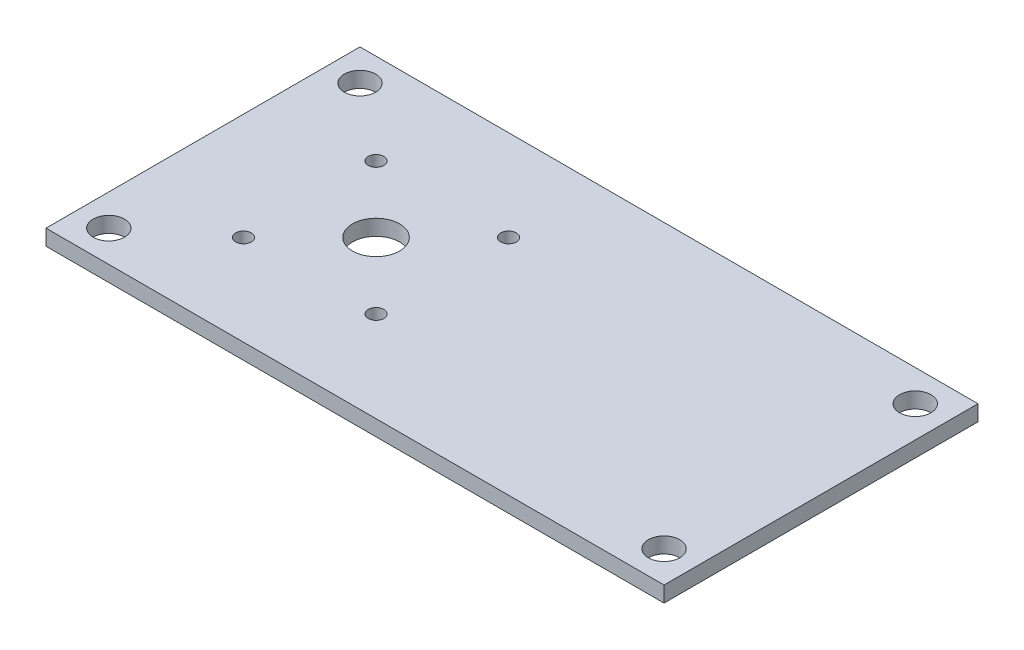
ISO-10303-21;
HEADER;
FILE_DESCRIPTION(('STEP AP214'),'2;1');
FILE_NAME('part.step','',(''),(''),'','','');
FILE_SCHEMA(('AUTOMOTIVE_DESIGN { 1 0 10303 214 1 1 1 1 }'));
ENDSEC;
DATA;
#1=APPLICATION_CONTEXT('core data for automotive mechanical design processes');
#2=APPLICATION_PROTOCOL_DEFINITION('international standard','automotive_design',2000,#1);
#3=PRODUCT_CONTEXT('',#1,'mechanical');
#4=PRODUCT('Part','Part','',(#3));
#5=PRODUCT_RELATED_PRODUCT_CATEGORY('part','',(#4));
#6=PRODUCT_DEFINITION_FORMATION('','',#4);
#7=PRODUCT_DEFINITION_CONTEXT('part definition',#1,'design');
#8=PRODUCT_DEFINITION('design','',#6,#7);
#9=PRODUCT_DEFINITION_SHAPE('','',#8);
#10=(LENGTH_UNIT() NAMED_UNIT(*) SI_UNIT(.MILLI.,.METRE.));
#11=(NAMED_UNIT(*) PLANE_ANGLE_UNIT() SI_UNIT($,.RADIAN.));
#12=(NAMED_UNIT(*) SI_UNIT($,.STERADIAN.) SOLID_ANGLE_UNIT());
#13=UNCERTAINTY_MEASURE_WITH_UNIT(LENGTH_MEASURE(1.E-05),#10,'distance_accuracy_value','');
#14=(GEOMETRIC_REPRESENTATION_CONTEXT(3) GLOBAL_UNCERTAINTY_ASSIGNED_CONTEXT((#13)) GLOBAL_UNIT_ASSIGNED_CONTEXT((#10,
#11,#12)) REPRESENTATION_CONTEXT('',''));
#15=CARTESIAN_POINT('',(0.,0.,0.));
#16=DIRECTION('',(0.,0.,1.));
#17=DIRECTION('',(1.,0.,0.));
#18=AXIS2_PLACEMENT_3D('',#15,#16,#17);
#19=CARTESIAN_POINT('',(0.,6.35,0.));
#20=DIRECTION('',(1.,0.,0.));
#21=DIRECTION('',(0.,0.,-1.));
#22=AXIS2_PLACEMENT_3D('',#19,#20,#21);
#23=PLANE('',#22);
#24=DIRECTION('',(0.,0.,1.));
#25=VECTOR('',#24,1.);
#26=CARTESIAN_POINT('',(0.,0.,0.));
#27=LINE('',#26,#25);
#28=CARTESIAN_POINT('',(0.,0.,-127.));
#29=VERTEX_POINT('',#28);
#30=CARTESIAN_POINT('',(0.,0.,0.));
#31=VERTEX_POINT('',#30);
#32=EDGE_CURVE('E95',#29,#31,#27,.T.);
#33=ORIENTED_EDGE('',*,*,#32,.T.);
#34=DIRECTION('',(0.,-1.,0.));
#35=VECTOR('',#34,1.);
#36=CARTESIAN_POINT('',(0.,6.35,0.));
#37=LINE('',#36,#35);
#38=CARTESIAN_POINT('',(0.,6.35,0.));
#39=VERTEX_POINT('',#38);
#40=EDGE_CURVE('E11',#39,#31,#37,.T.);
#41=ORIENTED_EDGE('',*,*,#40,.F.);
#42=DIRECTION('',(0.,0.,1.));
#43=VECTOR('',#42,1.);
#44=CARTESIAN_POINT('',(0.,6.35,0.));
#45=LINE('',#44,#43);
#46=CARTESIAN_POINT('',(0.,6.35,-127.));
#47=VERTEX_POINT('',#46);
#48=EDGE_CURVE('E83',#47,#39,#45,.T.);
#49=ORIENTED_EDGE('',*,*,#48,.F.);
#50=DIRECTION('',(0.,-1.,0.));
#51=VECTOR('',#50,1.);
#52=CARTESIAN_POINT('',(0.,6.35,-127.));
#53=LINE('',#52,#51);
#54=EDGE_CURVE('E91',#47,#29,#53,.T.);
#55=ORIENTED_EDGE('',*,*,#54,.T.);
#56=EDGE_LOOP('',(#33,#41,#49,#55));
#57=FACE_BOUND('',#56,.T.);
#58=ADVANCED_FACE('F32',(#57),#23,.F.);
#59=CARTESIAN_POINT('',(0.,6.35,0.));
#60=DIRECTION('',(0.,0.,-1.));
#61=DIRECTION('',(-1.,0.,0.));
#62=AXIS2_PLACEMENT_3D('',#59,#60,#61);
#63=PLANE('',#62);
#64=DIRECTION('',(1.,0.,0.));
#65=VECTOR('',#64,1.);
#66=CARTESIAN_POINT('',(0.,0.,0.));
#67=LINE('',#66,#65);
#68=CARTESIAN_POINT('',(250.,0.,0.));
#69=VERTEX_POINT('',#68);
#70=EDGE_CURVE('E87',#31,#69,#67,.T.);
#71=ORIENTED_EDGE('',*,*,#70,.T.);
#72=DIRECTION('',(0.,-1.,0.));
#73=VECTOR('',#72,1.);
#74=CARTESIAN_POINT('',(250.,6.35,0.));
#75=LINE('',#74,#73);
#76=CARTESIAN_POINT('',(250.,6.35,0.));
#77=VERTEX_POINT('',#76);
#78=EDGE_CURVE('E40',#77,#69,#75,.T.);
#79=ORIENTED_EDGE('',*,*,#78,.F.);
#80=DIRECTION('',(1.,0.,0.));
#81=VECTOR('',#80,1.);
#82=CARTESIAN_POINT('',(0.,6.35,0.));
#83=LINE('',#82,#81);
#84=EDGE_CURVE('E78',#39,#77,#83,.T.);
#85=ORIENTED_EDGE('',*,*,#84,.F.);
#86=ORIENTED_EDGE('',*,*,#40,.T.);
#87=EDGE_LOOP('',(#71,#79,#85,#86));
#88=FACE_BOUND('',#87,.T.);
#89=ADVANCED_FACE('F86',(#88),#63,.F.);
#90=CARTESIAN_POINT('',(250.,6.35,0.));
#91=DIRECTION('',(-1.,0.,0.));
#92=DIRECTION('',(0.,0.,1.));
#93=AXIS2_PLACEMENT_3D('',#90,#91,#92);
#94=PLANE('',#93);
#95=DIRECTION('',(0.,0.,-1.));
#96=VECTOR('',#95,1.);
#97=CARTESIAN_POINT('',(250.,0.,0.));
#98=LINE('',#97,#96);
#99=CARTESIAN_POINT('',(250.,0.,-127.));
#100=VERTEX_POINT('',#99);
#101=EDGE_CURVE('E65',#69,#100,#98,.T.);
#102=ORIENTED_EDGE('',*,*,#101,.T.);
#103=DIRECTION('',(0.,-1.,0.));
#104=VECTOR('',#103,1.);
#105=CARTESIAN_POINT('',(250.,6.35,-127.));
#106=LINE('',#105,#104);
#107=CARTESIAN_POINT('',(250.,6.35,-127.));
#108=VERTEX_POINT('',#107);
#109=EDGE_CURVE('E88',#108,#100,#106,.T.);
#110=ORIENTED_EDGE('',*,*,#109,.F.);
#111=DIRECTION('',(0.,0.,-1.));
#112=VECTOR('',#111,1.);
#113=CARTESIAN_POINT('',(250.,6.35,0.));
#114=LINE('',#113,#112);
#115=EDGE_CURVE('E81',#77,#108,#114,.T.);
#116=ORIENTED_EDGE('',*,*,#115,.F.);
#117=ORIENTED_EDGE('',*,*,#78,.T.);
#118=EDGE_LOOP('',(#102,#110,#116,#117));
#119=FACE_BOUND('',#118,.T.);
#120=ADVANCED_FACE('F89',(#119),#94,.F.);
#121=CARTESIAN_POINT('',(0.,6.35,-127.));
#122=DIRECTION('',(0.,0.,1.));
#123=DIRECTION('',(1.,0.,0.));
#124=AXIS2_PLACEMENT_3D('',#121,#122,#123);
#125=PLANE('',#124);
#126=DIRECTION('',(-1.,0.,0.));
#127=VECTOR('',#126,1.);
#128=CARTESIAN_POINT('',(0.,0.,-127.));
#129=LINE('',#128,#127);
#130=EDGE_CURVE('E71',#100,#29,#129,.T.);
#131=ORIENTED_EDGE('',*,*,#130,.T.);
#132=ORIENTED_EDGE('',*,*,#54,.F.);
#133=DIRECTION('',(-1.,0.,0.));
#134=VECTOR('',#133,1.);
#135=CARTESIAN_POINT('',(0.,6.35,-127.));
#136=LINE('',#135,#134);
#137=EDGE_CURVE('E48',#108,#47,#136,.T.);
#138=ORIENTED_EDGE('',*,*,#137,.F.);
#139=ORIENTED_EDGE('',*,*,#109,.T.);
#140=EDGE_LOOP('',(#131,#132,#138,#139));
#141=FACE_BOUND('',#140,.T.);
#142=ADVANCED_FACE('F103',(#141),#125,.F.);
#143=CARTESIAN_POINT('',(0.,6.35,0.));
#144=DIRECTION('',(0.,-1.,0.));
#145=DIRECTION('',(0.,0.,-1.));
#146=AXIS2_PLACEMENT_3D('',#143,#144,#145);
#147=PLANE('',#146);
#148=CARTESIAN_POINT('',(70.,6.35,-63.5));
#149=DIRECTION('',(0.,1.,0.));
#150=DIRECTION('',(0.,0.,1.));
#151=AXIS2_PLACEMENT_3D('',#148,#149,#150);
#152=CIRCLE('',#151,9.52500000000001);
#153=CARTESIAN_POINT('',(70.,6.35,-53.975));
#154=VERTEX_POINT('',#153);
#155=EDGE_CURVE('E157',#154,#154,#152,.T.);
#156=ORIENTED_EDGE('',*,*,#155,.F.);
#157=EDGE_LOOP('',(#156));
#158=FACE_BOUND('',#157,.T.);
#159=CARTESIAN_POINT('',(43.193581925218,6.35,-90.306418074782));
#160=DIRECTION('',(0.,1.,0.));
#161=DIRECTION('',(0.,0.,1.));
#162=AXIS2_PLACEMENT_3D('',#159,#160,#161);
#163=CIRCLE('',#162,3.175);
#164=CARTESIAN_POINT('',(43.193581925218,6.35,-87.131418074782));
#165=VERTEX_POINT('',#164);
#166=EDGE_CURVE('E151',#165,#165,#163,.T.);
#167=ORIENTED_EDGE('',*,*,#166,.F.);
#168=EDGE_LOOP('',(#167));
#169=FACE_BOUND('',#168,.T.);
#170=CARTESIAN_POINT('',(96.806418074782,6.35,-90.306418074782));
#171=DIRECTION('',(0.,1.,0.));
#172=DIRECTION('',(0.,0.,1.));
#173=AXIS2_PLACEMENT_3D('',#170,#171,#172);
#174=CIRCLE('',#173,3.175);
#175=CARTESIAN_POINT('',(96.806418074782,6.35,-87.131418074782));
#176=VERTEX_POINT('',#175);
#177=EDGE_CURVE('E145',#176,#176,#174,.T.);
#178=ORIENTED_EDGE('',*,*,#177,.F.);
#179=EDGE_LOOP('',(#178));
#180=FACE_BOUND('',#179,.T.);
#181=CARTESIAN_POINT('',(96.806418074782,6.35,-36.693581925218));
#182=DIRECTION('',(0.,1.,0.));
#183=DIRECTION('',(0.,0.,1.));
#184=AXIS2_PLACEMENT_3D('',#181,#182,#183);
#185=CIRCLE('',#184,3.175);
#186=CARTESIAN_POINT('',(96.806418074782,6.35,-33.518581925218));
#187=VERTEX_POINT('',#186);
#188=EDGE_CURVE('E139',#187,#187,#185,.T.);
#189=ORIENTED_EDGE('',*,*,#188,.F.);
#190=EDGE_LOOP('',(#189));
#191=FACE_BOUND('',#190,.T.);
#192=CARTESIAN_POINT('',(43.193581925218,6.35,-36.693581925218));
#193=DIRECTION('',(0.,1.,0.));
#194=DIRECTION('',(0.,0.,1.));
#195=AXIS2_PLACEMENT_3D('',#192,#193,#194);
#196=CIRCLE('',#195,3.175);
#197=CARTESIAN_POINT('',(43.193581925218,6.35,-33.518581925218));
#198=VERTEX_POINT('',#197);
#199=EDGE_CURVE('E133',#198,#198,#196,.T.);
#200=ORIENTED_EDGE('',*,*,#199,.F.);
#201=EDGE_LOOP('',(#200));
#202=FACE_BOUND('',#201,.T.);
#203=CARTESIAN_POINT('',(12.7,6.35,-114.3));
#204=DIRECTION('',(0.,1.,0.));
#205=DIRECTION('',(0.,0.,1.));
#206=AXIS2_PLACEMENT_3D('',#203,#204,#205);
#207=CIRCLE('',#206,6.35);
#208=CARTESIAN_POINT('',(12.7,6.35,-107.95));
#209=VERTEX_POINT('',#208);
#210=EDGE_CURVE('E127',#209,#209,#207,.T.);
#211=ORIENTED_EDGE('',*,*,#210,.F.);
#212=EDGE_LOOP('',(#211));
#213=FACE_BOUND('',#212,.T.);
#214=CARTESIAN_POINT('',(12.7,6.35,-12.7));
#215=DIRECTION('',(0.,1.,0.));
#216=DIRECTION('',(0.,0.,1.));
#217=AXIS2_PLACEMENT_3D('',#214,#215,#216);
#218=CIRCLE('',#217,6.35);
#219=CARTESIAN_POINT('',(12.7,6.35,-6.35));
#220=VERTEX_POINT('',#219);
#221=EDGE_CURVE('E121',#220,#220,#218,.T.);
#222=ORIENTED_EDGE('',*,*,#221,.F.);
#223=EDGE_LOOP('',(#222));
#224=FACE_BOUND('',#223,.T.);
#225=CARTESIAN_POINT('',(237.3,6.35,-114.3));
#226=DIRECTION('',(0.,1.,0.));
#227=DIRECTION('',(0.,0.,1.));
#228=AXIS2_PLACEMENT_3D('',#225,#226,#227);
#229=CIRCLE('',#228,6.34999999999994);
#230=CARTESIAN_POINT('',(237.3,6.35,-107.95));
#231=VERTEX_POINT('',#230);
#232=EDGE_CURVE('E115',#231,#231,#229,.T.);
#233=ORIENTED_EDGE('',*,*,#232,.F.);
#234=EDGE_LOOP('',(#233));
#235=FACE_BOUND('',#234,.T.);
#236=CARTESIAN_POINT('',(237.3,6.35,-12.7));
#237=DIRECTION('',(0.,1.,0.));
#238=DIRECTION('',(0.,0.,1.));
#239=AXIS2_PLACEMENT_3D('',#236,#237,#238);
#240=CIRCLE('',#239,6.35);
#241=CARTESIAN_POINT('',(237.3,6.35,-6.35000000000001));
#242=VERTEX_POINT('',#241);
#243=EDGE_CURVE('E109',#242,#242,#240,.T.);
#244=ORIENTED_EDGE('',*,*,#243,.F.);
#245=EDGE_LOOP('',(#244));
#246=FACE_BOUND('',#245,.T.);
#247=ORIENTED_EDGE('',*,*,#48,.T.);
#248=ORIENTED_EDGE('',*,*,#84,.T.);
#249=ORIENTED_EDGE('',*,*,#115,.T.);
#250=ORIENTED_EDGE('',*,*,#137,.T.);
#251=EDGE_LOOP('',(#247,#248,#249,#250));
#252=FACE_BOUND('',#251,.T.);
#253=ADVANCED_FACE('F79',(#158,#169,#180,#191,#202,#213,#224,#235,#246,#252),#147,.F.);
#254=CARTESIAN_POINT('',(0.,0.,0.));
#255=DIRECTION('',(0.,-1.,0.));
#256=DIRECTION('',(0.,0.,-1.));
#257=AXIS2_PLACEMENT_3D('',#254,#255,#256);
#258=PLANE('',#257);
#259=CARTESIAN_POINT('',(70.,0.,-63.5));
#260=DIRECTION('',(0.,1.,0.));
#261=DIRECTION('',(0.,0.,1.));
#262=AXIS2_PLACEMENT_3D('',#259,#260,#261);
#263=CIRCLE('',#262,9.52500000000001);
#264=CARTESIAN_POINT('',(70.,0.,-53.975));
#265=VERTEX_POINT('',#264);
#266=EDGE_CURVE('E154',#265,#265,#263,.T.);
#267=ORIENTED_EDGE('',*,*,#266,.T.);
#268=EDGE_LOOP('',(#267));
#269=FACE_BOUND('',#268,.T.);
#270=CARTESIAN_POINT('',(43.193581925218,0.,-90.306418074782));
#271=DIRECTION('',(0.,1.,0.));
#272=DIRECTION('',(0.,0.,1.));
#273=AXIS2_PLACEMENT_3D('',#270,#271,#272);
#274=CIRCLE('',#273,3.175);
#275=CARTESIAN_POINT('',(43.193581925218,0.,-87.131418074782));
#276=VERTEX_POINT('',#275);
#277=EDGE_CURVE('E148',#276,#276,#274,.T.);
#278=ORIENTED_EDGE('',*,*,#277,.T.);
#279=EDGE_LOOP('',(#278));
#280=FACE_BOUND('',#279,.T.);
#281=CARTESIAN_POINT('',(96.806418074782,0.,-90.306418074782));
#282=DIRECTION('',(0.,1.,0.));
#283=DIRECTION('',(0.,0.,1.));
#284=AXIS2_PLACEMENT_3D('',#281,#282,#283);
#285=CIRCLE('',#284,3.175);
#286=CARTESIAN_POINT('',(96.806418074782,0.,-87.131418074782));
#287=VERTEX_POINT('',#286);
#288=EDGE_CURVE('E142',#287,#287,#285,.T.);
#289=ORIENTED_EDGE('',*,*,#288,.T.);
#290=EDGE_LOOP('',(#289));
#291=FACE_BOUND('',#290,.T.);
#292=CARTESIAN_POINT('',(96.806418074782,0.,-36.693581925218));
#293=DIRECTION('',(0.,1.,0.));
#294=DIRECTION('',(0.,0.,1.));
#295=AXIS2_PLACEMENT_3D('',#292,#293,#294);
#296=CIRCLE('',#295,3.175);
#297=CARTESIAN_POINT('',(96.806418074782,0.,-33.518581925218));
#298=VERTEX_POINT('',#297);
#299=EDGE_CURVE('E136',#298,#298,#296,.T.);
#300=ORIENTED_EDGE('',*,*,#299,.T.);
#301=EDGE_LOOP('',(#300));
#302=FACE_BOUND('',#301,.T.);
#303=CARTESIAN_POINT('',(43.193581925218,0.,-36.693581925218));
#304=DIRECTION('',(0.,1.,0.));
#305=DIRECTION('',(0.,0.,1.));
#306=AXIS2_PLACEMENT_3D('',#303,#304,#305);
#307=CIRCLE('',#306,3.175);
#308=CARTESIAN_POINT('',(43.193581925218,0.,-33.518581925218));
#309=VERTEX_POINT('',#308);
#310=EDGE_CURVE('E130',#309,#309,#307,.T.);
#311=ORIENTED_EDGE('',*,*,#310,.T.);
#312=EDGE_LOOP('',(#311));
#313=FACE_BOUND('',#312,.T.);
#314=CARTESIAN_POINT('',(12.7,0.,-114.3));
#315=DIRECTION('',(0.,1.,0.));
#316=DIRECTION('',(0.,0.,1.));
#317=AXIS2_PLACEMENT_3D('',#314,#315,#316);
#318=CIRCLE('',#317,6.35);
#319=CARTESIAN_POINT('',(12.7,0.,-107.95));
#320=VERTEX_POINT('',#319);
#321=EDGE_CURVE('E124',#320,#320,#318,.T.);
#322=ORIENTED_EDGE('',*,*,#321,.T.);
#323=EDGE_LOOP('',(#322));
#324=FACE_BOUND('',#323,.T.);
#325=CARTESIAN_POINT('',(12.7,0.,-12.7));
#326=DIRECTION('',(0.,1.,0.));
#327=DIRECTION('',(0.,0.,1.));
#328=AXIS2_PLACEMENT_3D('',#325,#326,#327);
#329=CIRCLE('',#328,6.35);
#330=CARTESIAN_POINT('',(12.7,0.,-6.35));
#331=VERTEX_POINT('',#330);
#332=EDGE_CURVE('E118',#331,#331,#329,.T.);
#333=ORIENTED_EDGE('',*,*,#332,.T.);
#334=EDGE_LOOP('',(#333));
#335=FACE_BOUND('',#334,.T.);
#336=CARTESIAN_POINT('',(237.3,0.,-114.3));
#337=DIRECTION('',(0.,1.,0.));
#338=DIRECTION('',(0.,0.,1.));
#339=AXIS2_PLACEMENT_3D('',#336,#337,#338);
#340=CIRCLE('',#339,6.34999999999994);
#341=CARTESIAN_POINT('',(237.3,0.,-107.95));
#342=VERTEX_POINT('',#341);
#343=EDGE_CURVE('E112',#342,#342,#340,.T.);
#344=ORIENTED_EDGE('',*,*,#343,.T.);
#345=EDGE_LOOP('',(#344));
#346=FACE_BOUND('',#345,.T.);
#347=CARTESIAN_POINT('',(237.3,0.,-12.7));
#348=DIRECTION('',(0.,1.,0.));
#349=DIRECTION('',(0.,0.,1.));
#350=AXIS2_PLACEMENT_3D('',#347,#348,#349);
#351=CIRCLE('',#350,6.35);
#352=CARTESIAN_POINT('',(237.3,0.,-6.35000000000001));
#353=VERTEX_POINT('',#352);
#354=EDGE_CURVE('E98',#353,#353,#351,.T.);
#355=ORIENTED_EDGE('',*,*,#354,.T.);
#356=EDGE_LOOP('',(#355));
#357=FACE_BOUND('',#356,.T.);
#358=ORIENTED_EDGE('',*,*,#32,.F.);
#359=ORIENTED_EDGE('',*,*,#130,.F.);
#360=ORIENTED_EDGE('',*,*,#101,.F.);
#361=ORIENTED_EDGE('',*,*,#70,.F.);
#362=EDGE_LOOP('',(#358,#359,#360,#361));
#363=FACE_BOUND('',#362,.T.);
#364=ADVANCED_FACE('F106',(#269,#280,#291,#302,#313,#324,#335,#346,#357,#363),#258,.T.);
#365=CARTESIAN_POINT('',(237.3,0.,-12.7));
#366=DIRECTION('',(0.,1.,0.));
#367=DIRECTION('',(0.,0.,1.));
#368=AXIS2_PLACEMENT_3D('',#365,#366,#367);
#369=CYLINDRICAL_SURFACE('',#368,6.35);
#370=ORIENTED_EDGE('',*,*,#354,.F.);
#371=EDGE_LOOP('',(#370));
#372=FACE_BOUND('',#371,.T.);
#373=ORIENTED_EDGE('',*,*,#243,.T.);
#374=EDGE_LOOP('',(#373));
#375=FACE_BOUND('',#374,.T.);
#376=ADVANCED_FACE('F191',(#372,#375),#369,.F.);
#377=CARTESIAN_POINT('',(237.3,0.,-114.3));
#378=DIRECTION('',(0.,1.,0.));
#379=DIRECTION('',(0.,0.,1.));
#380=AXIS2_PLACEMENT_3D('',#377,#378,#379);
#381=CYLINDRICAL_SURFACE('',#380,6.34999999999994);
#382=ORIENTED_EDGE('',*,*,#343,.F.);
#383=EDGE_LOOP('',(#382));
#384=FACE_BOUND('',#383,.T.);
#385=ORIENTED_EDGE('',*,*,#232,.T.);
#386=EDGE_LOOP('',(#385));
#387=FACE_BOUND('',#386,.T.);
#388=ADVANCED_FACE('F193',(#384,#387),#381,.F.);
#389=CARTESIAN_POINT('',(12.7,0.,-12.7));
#390=DIRECTION('',(0.,1.,0.));
#391=DIRECTION('',(0.,0.,1.));
#392=AXIS2_PLACEMENT_3D('',#389,#390,#391);
#393=CYLINDRICAL_SURFACE('',#392,6.35);
#394=ORIENTED_EDGE('',*,*,#332,.F.);
#395=EDGE_LOOP('',(#394));
#396=FACE_BOUND('',#395,.T.);
#397=ORIENTED_EDGE('',*,*,#221,.T.);
#398=EDGE_LOOP('',(#397));
#399=FACE_BOUND('',#398,.T.);
#400=ADVANCED_FACE('F200',(#396,#399),#393,.F.);
#401=CARTESIAN_POINT('',(12.7,0.,-114.3));
#402=DIRECTION('',(0.,1.,0.));
#403=DIRECTION('',(0.,0.,1.));
#404=AXIS2_PLACEMENT_3D('',#401,#402,#403);
#405=CYLINDRICAL_SURFACE('',#404,6.35);
#406=ORIENTED_EDGE('',*,*,#321,.F.);
#407=EDGE_LOOP('',(#406));
#408=FACE_BOUND('',#407,.T.);
#409=ORIENTED_EDGE('',*,*,#210,.T.);
#410=EDGE_LOOP('',(#409));
#411=FACE_BOUND('',#410,.T.);
#412=ADVANCED_FACE('F246',(#408,#411),#405,.F.);
#413=CARTESIAN_POINT('',(43.193581925218,0.,-36.693581925218));
#414=DIRECTION('',(0.,1.,0.));
#415=DIRECTION('',(0.,0.,1.));
#416=AXIS2_PLACEMENT_3D('',#413,#414,#415);
#417=CYLINDRICAL_SURFACE('',#416,3.175);
#418=ORIENTED_EDGE('',*,*,#310,.F.);
#419=EDGE_LOOP('',(#418));
#420=FACE_BOUND('',#419,.T.);
#421=ORIENTED_EDGE('',*,*,#199,.T.);
#422=EDGE_LOOP('',(#421));
#423=FACE_BOUND('',#422,.T.);
#424=ADVANCED_FACE('F256',(#420,#423),#417,.F.);
#425=CARTESIAN_POINT('',(96.806418074782,0.,-36.693581925218));
#426=DIRECTION('',(0.,1.,0.));
#427=DIRECTION('',(0.,0.,1.));
#428=AXIS2_PLACEMENT_3D('',#425,#426,#427);
#429=CYLINDRICAL_SURFACE('',#428,3.175);
#430=ORIENTED_EDGE('',*,*,#299,.F.);
#431=EDGE_LOOP('',(#430));
#432=FACE_BOUND('',#431,.T.);
#433=ORIENTED_EDGE('',*,*,#188,.T.);
#434=EDGE_LOOP('',(#433));
#435=FACE_BOUND('',#434,.T.);
#436=ADVANCED_FACE('F266',(#432,#435),#429,.F.);
#437=CARTESIAN_POINT('',(96.806418074782,0.,-90.306418074782));
#438=DIRECTION('',(0.,1.,0.));
#439=DIRECTION('',(0.,0.,1.));
#440=AXIS2_PLACEMENT_3D('',#437,#438,#439);
#441=CYLINDRICAL_SURFACE('',#440,3.175);
#442=ORIENTED_EDGE('',*,*,#288,.F.);
#443=EDGE_LOOP('',(#442));
#444=FACE_BOUND('',#443,.T.);
#445=ORIENTED_EDGE('',*,*,#177,.T.);
#446=EDGE_LOOP('',(#445));
#447=FACE_BOUND('',#446,.T.);
#448=ADVANCED_FACE('F276',(#444,#447),#441,.F.);
#449=CARTESIAN_POINT('',(43.193581925218,0.,-90.306418074782));
#450=DIRECTION('',(0.,1.,0.));
#451=DIRECTION('',(0.,0.,1.));
#452=AXIS2_PLACEMENT_3D('',#449,#450,#451);
#453=CYLINDRICAL_SURFACE('',#452,3.175);
#454=ORIENTED_EDGE('',*,*,#277,.F.);
#455=EDGE_LOOP('',(#454));
#456=FACE_BOUND('',#455,.T.);
#457=ORIENTED_EDGE('',*,*,#166,.T.);
#458=EDGE_LOOP('',(#457));
#459=FACE_BOUND('',#458,.T.);
#460=ADVANCED_FACE('F168',(#456,#459),#453,.F.);
#461=CARTESIAN_POINT('',(70.,0.,-63.5));
#462=DIRECTION('',(0.,1.,0.));
#463=DIRECTION('',(0.,0.,1.));
#464=AXIS2_PLACEMENT_3D('',#461,#462,#463);
#465=CYLINDRICAL_SURFACE('',#464,9.52500000000001);
#466=ORIENTED_EDGE('',*,*,#266,.F.);
#467=EDGE_LOOP('',(#466));
#468=FACE_BOUND('',#467,.T.);
#469=ORIENTED_EDGE('',*,*,#155,.T.);
#470=EDGE_LOOP('',(#469));
#471=FACE_BOUND('',#470,.T.);
#472=ADVANCED_FACE('F165',(#468,#471),#465,.F.);
#473=CLOSED_SHELL('',(#58,#89,#120,#142,#253,#364,#376,#388,#400,#412,#424,#436,#448,#460,#472));
#474=MANIFOLD_SOLID_BREP('B2',#473);
#475=ADVANCED_BREP_SHAPE_REPRESENTATION('',(#18,#474),#14);
#476=SHAPE_DEFINITION_REPRESENTATION(#9,#475);
ENDSEC;
END-ISO-10303-21;
